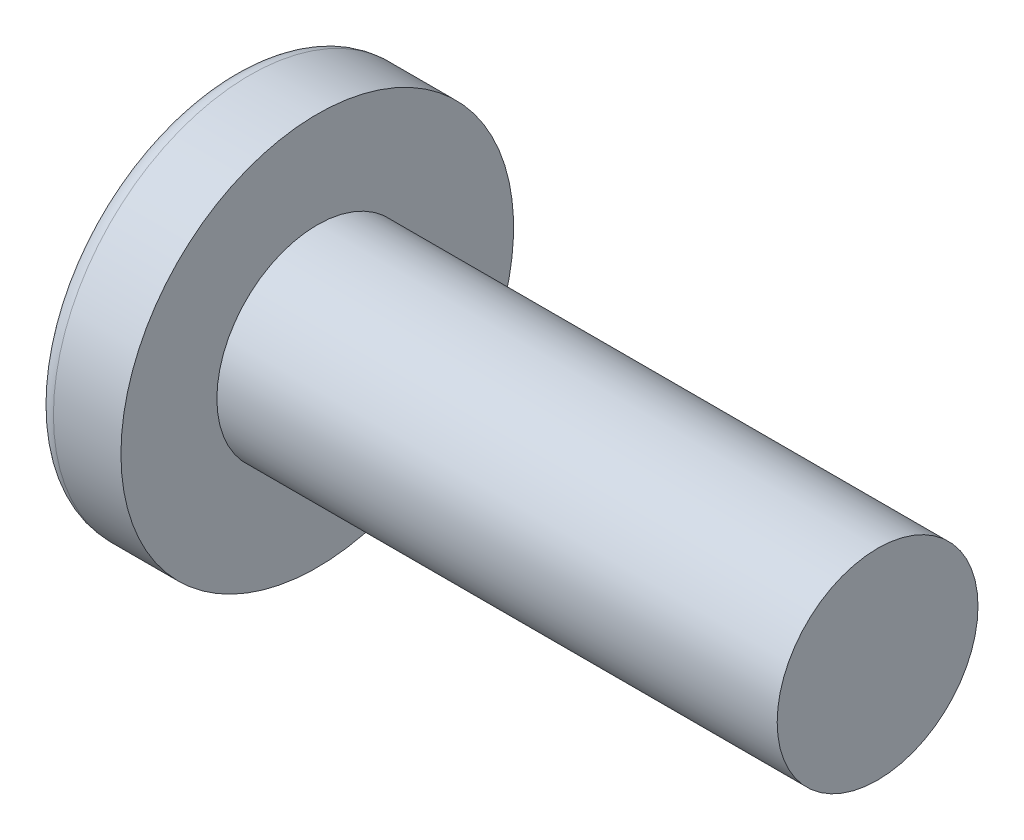
ISO-10303-21;
HEADER;
FILE_DESCRIPTION(('STEP AP214'),'2;1');
FILE_NAME('part.step','',(''),(''),'','','');
FILE_SCHEMA(('AUTOMOTIVE_DESIGN { 1 0 10303 214 1 1 1 1 }'));
ENDSEC;
DATA;
#1=APPLICATION_CONTEXT('core data for automotive mechanical design processes');
#2=APPLICATION_PROTOCOL_DEFINITION('international standard','automotive_design',2000,#1);
#3=PRODUCT_CONTEXT('',#1,'mechanical');
#4=PRODUCT('Part','Part','',(#3));
#5=PRODUCT_RELATED_PRODUCT_CATEGORY('part','',(#4));
#6=PRODUCT_DEFINITION_FORMATION('','',#4);
#7=PRODUCT_DEFINITION_CONTEXT('part definition',#1,'design');
#8=PRODUCT_DEFINITION('design','',#6,#7);
#9=PRODUCT_DEFINITION_SHAPE('','',#8);
#10=(LENGTH_UNIT() NAMED_UNIT(*) SI_UNIT(.MILLI.,.METRE.));
#11=(NAMED_UNIT(*) PLANE_ANGLE_UNIT() SI_UNIT($,.RADIAN.));
#12=(NAMED_UNIT(*) SI_UNIT($,.STERADIAN.) SOLID_ANGLE_UNIT());
#13=UNCERTAINTY_MEASURE_WITH_UNIT(LENGTH_MEASURE(1.E-05),#10,'distance_accuracy_value','');
#14=(GEOMETRIC_REPRESENTATION_CONTEXT(3) GLOBAL_UNCERTAINTY_ASSIGNED_CONTEXT((#13)) GLOBAL_UNIT_ASSIGNED_CONTEXT((#10,
#11,#12)) REPRESENTATION_CONTEXT('',''));
#15=CARTESIAN_POINT('',(0.,0.,0.));
#16=DIRECTION('',(0.,0.,1.));
#17=DIRECTION('',(1.,0.,0.));
#18=AXIS2_PLACEMENT_3D('',#15,#16,#17);
#19=CARTESIAN_POINT('',(4.55168,0.,0.));
#20=DIRECTION('',(-1.,0.,0.));
#21=DIRECTION('',(0.,1.,0.));
#22=AXIS2_PLACEMENT_3D('',#19,#20,#21);
#23=SPHERICAL_SURFACE('',#22,4.55168);
#24=CARTESIAN_POINT('',(0.870207289833468,0.,0.));
#25=DIRECTION('',(-1.,0.,0.));
#26=DIRECTION('',(0.,0.,1.));
#27=AXIS2_PLACEMENT_3D('',#24,#25,#26);
#28=CIRCLE('',#27,2.67666761229314);
#29=CARTESIAN_POINT('',(0.870207289833468,0.,2.67666761229314));
#30=VERTEX_POINT('',#29);
#31=EDGE_CURVE('E152',#30,#30,#28,.T.);
#32=ORIENTED_EDGE('',*,*,#31,.T.);
#33=EDGE_LOOP('',(#32));
#34=FACE_BOUND('',#33,.T.);
#35=CARTESIAN_POINT('',(4.54621406502776,-0.053976107850912,0.));
#36=DIRECTION('',(-0.100750553686815,-0.994911717657301,0.));
#37=DIRECTION('',(0.994911717657301,-0.100750553686815,0.));
#38=AXIS2_PLACEMENT_3D('',#35,#36,#37);
#39=CIRCLE('',#38,4.55135666870178);
#40=CARTESIAN_POINT('',(0.29828010421487,0.376194419826337,1.57634320737159));
#41=VERTEX_POINT('',#40);
#42=CARTESIAN_POINT('',(0.0357821905509186,0.402776487032817,0.402776487032818));
#43=VERTEX_POINT('',#42);
#44=EDGE_CURVE('E183',#41,#43,#39,.T.);
#45=ORIENTED_EDGE('',*,*,#44,.F.);
#46=CARTESIAN_POINT('',(3.65196023945684,0.,-1.11933639500645));
#47=DIRECTION('',(0.626498155753381,0.,0.77942290243334));
#48=DIRECTION('',(0.77942290243334,0.,-0.626498155753381));
#49=AXIS2_PLACEMENT_3D('',#46,#47,#48);
#50=CIRCLE('',#49,4.31918756361681);
#51=CARTESIAN_POINT('',(0.29828010421487,-0.376194419826348,1.57634320737159));
#52=VERTEX_POINT('',#51);
#53=EDGE_CURVE('E148',#41,#52,#50,.T.);
#54=ORIENTED_EDGE('',*,*,#53,.T.);
#55=CARTESIAN_POINT('',(4.54621406502776,0.0539761078509117,0.));
#56=DIRECTION('',(-0.100750553686815,0.9949117176573,0.));
#57=DIRECTION('',(-0.994911717657301,-0.100750553686815,0.));
#58=AXIS2_PLACEMENT_3D('',#55,#56,#57);
#59=CIRCLE('',#58,4.55135666870178);
#60=CARTESIAN_POINT('',(0.0357821905509195,-0.40277648703282,0.402776487032818));
#61=VERTEX_POINT('',#60);
#62=EDGE_CURVE('E104',#61,#52,#59,.T.);
#63=ORIENTED_EDGE('',*,*,#62,.F.);
#64=CARTESIAN_POINT('',(4.54621406502776,0.,-0.0539761078509118));
#65=DIRECTION('',(-0.100750553686815,0.,-0.9949117176573));
#66=DIRECTION('',(-0.994911717657301,0.,0.100750553686815));
#67=AXIS2_PLACEMENT_3D('',#64,#65,#66);
#68=CIRCLE('',#67,4.55135666870178);
#69=CARTESIAN_POINT('',(0.298280104214868,-1.57634320737159,0.376194419826342));
#70=VERTEX_POINT('',#69);
#71=EDGE_CURVE('E129',#70,#61,#68,.T.);
#72=ORIENTED_EDGE('',*,*,#71,.F.);
#73=CARTESIAN_POINT('',(3.65196023945684,1.11933639500645,0.));
#74=DIRECTION('',(0.626498155753381,-0.77942290243334,0.));
#75=DIRECTION('',(0.77942290243334,0.626498155753381,0.));
#76=AXIS2_PLACEMENT_3D('',#73,#74,#75);
#77=CIRCLE('',#76,4.31918756361681);
#78=CARTESIAN_POINT('',(0.298280104214869,-1.57634320737159,-0.376194419826342));
#79=VERTEX_POINT('',#78);
#80=EDGE_CURVE('E137',#70,#79,#77,.T.);
#81=ORIENTED_EDGE('',*,*,#80,.T.);
#82=CARTESIAN_POINT('',(4.54621406502776,0.,0.053976107850912));
#83=DIRECTION('',(-0.100750553686815,0.,0.994911717657301));
#84=DIRECTION('',(0.994911717657301,0.,0.100750553686815));
#85=AXIS2_PLACEMENT_3D('',#82,#83,#84);
#86=CIRCLE('',#85,4.55135666870178);
#87=CARTESIAN_POINT('',(0.0357821905509186,-0.402776487032817,-0.402776487032818));
#88=VERTEX_POINT('',#87);
#89=EDGE_CURVE('E47',#88,#79,#86,.T.);
#90=ORIENTED_EDGE('',*,*,#89,.F.);
#91=CARTESIAN_POINT('',(0.298280104214868,-0.376194419826337,-1.57634320737159));
#92=VERTEX_POINT('',#91);
#93=EDGE_CURVE('E190',#92,#88,#59,.T.);
#94=ORIENTED_EDGE('',*,*,#93,.F.);
#95=CARTESIAN_POINT('',(3.65196023945684,0.,1.11933639500645));
#96=DIRECTION('',(0.626498155753381,0.,-0.77942290243334));
#97=DIRECTION('',(-0.77942290243334,0.,-0.626498155753381));
#98=AXIS2_PLACEMENT_3D('',#95,#96,#97);
#99=CIRCLE('',#98,4.31918756361681);
#100=CARTESIAN_POINT('',(0.298280104214869,0.376194419826348,-1.57634320737159));
#101=VERTEX_POINT('',#100);
#102=EDGE_CURVE('E130',#92,#101,#99,.T.);
#103=ORIENTED_EDGE('',*,*,#102,.T.);
#104=CARTESIAN_POINT('',(0.0357821905509195,0.40277648703282,-0.402776487032818));
#105=VERTEX_POINT('',#104);
#106=EDGE_CURVE('E178',#105,#101,#39,.T.);
#107=ORIENTED_EDGE('',*,*,#106,.F.);
#108=CARTESIAN_POINT('',(0.298280104214869,1.57634320737159,-0.376194419826342));
#109=VERTEX_POINT('',#108);
#110=EDGE_CURVE('E40',#109,#105,#86,.T.);
#111=ORIENTED_EDGE('',*,*,#110,.F.);
#112=CARTESIAN_POINT('',(3.65196023945684,-1.11933639500645,0.));
#113=DIRECTION('',(0.626498155753381,0.77942290243334,0.));
#114=DIRECTION('',(-0.77942290243334,0.626498155753381,0.));
#115=AXIS2_PLACEMENT_3D('',#112,#113,#114);
#116=CIRCLE('',#115,4.31918756361681);
#117=CARTESIAN_POINT('',(0.298280104214869,1.57634320737159,0.376194419826342));
#118=VERTEX_POINT('',#117);
#119=EDGE_CURVE('E11',#109,#118,#116,.T.);
#120=ORIENTED_EDGE('',*,*,#119,.T.);
#121=EDGE_CURVE('E166',#43,#118,#68,.T.);
#122=ORIENTED_EDGE('',*,*,#121,.F.);
#123=EDGE_LOOP('',(#45,#54,#63,#72,#81,#90,#94,#103,#107,#111,#120,#122));
#124=FACE_BOUND('',#123,.T.);
#125=ADVANCED_FACE('F32',(#34,#124),#23,.T.);
#126=CARTESIAN_POINT('',(2.2594,0.,-0.1776));
#127=DIRECTION('',(-0.100750553686815,0.,0.994911717657301));
#128=DIRECTION('',(0.994911717657301,0.,0.100750553686815));
#129=AXIS2_PLACEMENT_3D('',#126,#127,#128);
#130=PLANE('',#129);
#131=ORIENTED_EDGE('',*,*,#110,.T.);
#132=DIRECTION('',(0.989900325021556,-0.100243070888259,0.100243070888259));
#133=VECTOR('',#132,1.);
#134=CARTESIAN_POINT('',(2.27702336316533,0.175815355628828,-0.175815355628827));
#135=LINE('',#134,#133);
#136=CARTESIAN_POINT('',(2.0066,0.203200000000001,-0.203199999999999));
#137=VERTEX_POINT('',#136);
#138=EDGE_CURVE('E172',#105,#137,#135,.T.);
#139=ORIENTED_EDGE('',*,*,#138,.T.);
#140=DIRECTION('',(0.777006374114706,-0.624555756408656,0.0786841897837677));
#141=VECTOR('',#140,1.);
#142=CARTESIAN_POINT('',(0.,1.8161,-0.4064));
#143=LINE('',#142,#141);
#144=EDGE_CURVE('E153',#109,#137,#143,.T.);
#145=ORIENTED_EDGE('',*,*,#144,.F.);
#146=EDGE_LOOP('',(#131,#139,#145));
#147=FACE_BOUND('',#146,.T.);
#148=ADVANCED_FACE('F171',(#147),#130,.T.);
#149=DIRECTION('',(0.777006374114706,0.624555756408656,0.0786841897837677));
#150=VECTOR('',#149,1.);
#151=CARTESIAN_POINT('',(0.,-1.8161,-0.4064));
#152=LINE('',#151,#150);
#153=CARTESIAN_POINT('',(2.0066,-0.2032,-0.2032));
#154=VERTEX_POINT('',#153);
#155=EDGE_CURVE('E138',#79,#154,#152,.T.);
#156=ORIENTED_EDGE('',*,*,#155,.T.);
#157=DIRECTION('',(-0.989900325021557,-0.100243070888258,-0.100243070888259));
#158=VECTOR('',#157,1.);
#159=CARTESIAN_POINT('',(2.27702336316533,-0.175815355628826,-0.175815355628827));
#160=LINE('',#159,#158);
#161=EDGE_CURVE('E193',#154,#88,#160,.T.);
#162=ORIENTED_EDGE('',*,*,#161,.T.);
#163=ORIENTED_EDGE('',*,*,#89,.T.);
#164=EDGE_LOOP('',(#156,#162,#163));
#165=FACE_BOUND('',#164,.T.);
#166=ADVANCED_FACE('F208',(#165),#130,.T.);
#167=CARTESIAN_POINT('',(2.2594,0.,0.1776));
#168=DIRECTION('',(-0.100750553686815,0.,-0.9949117176573));
#169=DIRECTION('',(-0.994911717657301,0.,0.100750553686815));
#170=AXIS2_PLACEMENT_3D('',#167,#168,#169);
#171=PLANE('',#170);
#172=DIRECTION('',(0.777006374114706,-0.624555756408656,-0.0786841897837678));
#173=VECTOR('',#172,1.);
#174=CARTESIAN_POINT('',(0.,1.8161,0.4064));
#175=LINE('',#174,#173);
#176=CARTESIAN_POINT('',(2.0066,0.2032,0.2032));
#177=VERTEX_POINT('',#176);
#178=EDGE_CURVE('E209',#118,#177,#175,.T.);
#179=ORIENTED_EDGE('',*,*,#178,.T.);
#180=DIRECTION('',(-0.989900325021557,0.100243070888259,0.100243070888259));
#181=VECTOR('',#180,1.);
#182=CARTESIAN_POINT('',(2.27702336316533,0.175815355628826,0.175815355628827));
#183=LINE('',#182,#181);
#184=EDGE_CURVE('E187',#177,#43,#183,.T.);
#185=ORIENTED_EDGE('',*,*,#184,.T.);
#186=ORIENTED_EDGE('',*,*,#121,.T.);
#187=EDGE_LOOP('',(#179,#185,#186));
#188=FACE_BOUND('',#187,.T.);
#189=ADVANCED_FACE('F213',(#188),#171,.T.);
#190=ORIENTED_EDGE('',*,*,#71,.T.);
#191=DIRECTION('',(0.989900325021556,0.100243070888259,-0.100243070888259));
#192=VECTOR('',#191,1.);
#193=CARTESIAN_POINT('',(2.27702336316533,-0.175815355628828,0.175815355628827));
#194=LINE('',#193,#192);
#195=CARTESIAN_POINT('',(2.0066,-0.203200000000001,0.203199999999999));
#196=VERTEX_POINT('',#195);
#197=EDGE_CURVE('E102',#61,#196,#194,.T.);
#198=ORIENTED_EDGE('',*,*,#197,.T.);
#199=DIRECTION('',(0.777006374114707,0.624555756408656,-0.0786841897837676));
#200=VECTOR('',#199,1.);
#201=CARTESIAN_POINT('',(0.,-1.8161,0.4064));
#202=LINE('',#201,#200);
#203=EDGE_CURVE('E127',#70,#196,#202,.T.);
#204=ORIENTED_EDGE('',*,*,#203,.F.);
#205=EDGE_LOOP('',(#190,#198,#204));
#206=FACE_BOUND('',#205,.T.);
#207=ADVANCED_FACE('F126',(#206),#171,.T.);
#208=CARTESIAN_POINT('',(-25.4,0.,0.));
#209=DIRECTION('',(-1.,0.,0.));
#210=DIRECTION('',(0.,0.,1.));
#211=AXIS2_PLACEMENT_3D('',#208,#209,#210);
#212=CYLINDRICAL_SURFACE('',#211,1.4224);
#213=CARTESIAN_POINT('',(9.9695,0.,0.));
#214=DIRECTION('',(-1.,0.,0.));
#215=DIRECTION('',(0.,0.,1.));
#216=AXIS2_PLACEMENT_3D('',#213,#214,#215);
#217=CIRCLE('',#216,1.4224);
#218=CARTESIAN_POINT('',(9.9695,0.,1.4224));
#219=VERTEX_POINT('',#218);
#220=EDGE_CURVE('E149',#219,#219,#217,.T.);
#221=ORIENTED_EDGE('',*,*,#220,.T.);
#222=EDGE_LOOP('',(#221));
#223=FACE_BOUND('',#222,.T.);
#224=CARTESIAN_POINT('',(2.032,0.,0.));
#225=DIRECTION('',(-1.,0.,0.));
#226=DIRECTION('',(0.,0.,1.));
#227=AXIS2_PLACEMENT_3D('',#224,#225,#226);
#228=CIRCLE('',#227,1.4224);
#229=CARTESIAN_POINT('',(2.032,0.,1.4224));
#230=VERTEX_POINT('',#229);
#231=EDGE_CURVE('E162',#230,#230,#228,.T.);
#232=ORIENTED_EDGE('',*,*,#231,.F.);
#233=EDGE_LOOP('',(#232));
#234=FACE_BOUND('',#233,.T.);
#235=ADVANCED_FACE('F34',(#223,#234),#212,.T.);
#236=CARTESIAN_POINT('',(2.032,1.4224,0.));
#237=DIRECTION('',(-1.,0.,0.));
#238=DIRECTION('',(0.,0.,1.));
#239=AXIS2_PLACEMENT_3D('',#236,#237,#238);
#240=PLANE('',#239);
#241=CARTESIAN_POINT('',(2.032,0.,0.));
#242=DIRECTION('',(-1.,0.,0.));
#243=DIRECTION('',(0.,0.,1.));
#244=AXIS2_PLACEMENT_3D('',#241,#242,#243);
#245=CIRCLE('',#244,2.7813);
#246=CARTESIAN_POINT('',(2.032,0.,2.7813));
#247=VERTEX_POINT('',#246);
#248=EDGE_CURVE('E159',#247,#247,#245,.T.);
#249=ORIENTED_EDGE('',*,*,#248,.F.);
#250=EDGE_LOOP('',(#249));
#251=FACE_BOUND('',#250,.T.);
#252=ORIENTED_EDGE('',*,*,#231,.T.);
#253=EDGE_LOOP('',(#252));
#254=FACE_BOUND('',#253,.T.);
#255=ADVANCED_FACE('F241',(#251,#254),#240,.F.);
#256=CARTESIAN_POINT('',(-25.4,0.,0.));
#257=DIRECTION('',(-1.,0.,0.));
#258=DIRECTION('',(0.,0.,1.));
#259=AXIS2_PLACEMENT_3D('',#256,#257,#258);
#260=CYLINDRICAL_SURFACE('',#259,2.7813);
#261=ORIENTED_EDGE('',*,*,#248,.T.);
#262=EDGE_LOOP('',(#261));
#263=FACE_BOUND('',#262,.T.);
#264=CARTESIAN_POINT('',(1.07564661517758,0.,0.));
#265=DIRECTION('',(-1.,0.,0.));
#266=DIRECTION('',(0.,0.,1.));
#267=AXIS2_PLACEMENT_3D('',#264,#265,#266);
#268=CIRCLE('',#267,2.7813);
#269=CARTESIAN_POINT('',(1.07564661517758,0.,2.7813));
#270=VERTEX_POINT('',#269);
#271=EDGE_CURVE('E156',#270,#270,#268,.T.);
#272=ORIENTED_EDGE('',*,*,#271,.F.);
#273=EDGE_LOOP('',(#272));
#274=FACE_BOUND('',#273,.T.);
#275=ADVANCED_FACE('F238',(#263,#274),#260,.T.);
#276=CARTESIAN_POINT('',(1.07564661517758,0.,0.));
#277=DIRECTION('',(-1.,0.,0.));
#278=DIRECTION('',(0.,0.,1.));
#279=AXIS2_PLACEMENT_3D('',#276,#277,#278);
#280=TOROIDAL_SURFACE('',#279,2.5273,0.254);
#281=ORIENTED_EDGE('',*,*,#271,.T.);
#282=EDGE_LOOP('',(#281));
#283=FACE_BOUND('',#282,.T.);
#284=ORIENTED_EDGE('',*,*,#31,.F.);
#285=EDGE_LOOP('',(#284));
#286=FACE_BOUND('',#285,.T.);
#287=ADVANCED_FACE('F235',(#283,#286),#280,.T.);
#288=CARTESIAN_POINT('',(9.9695,1.4224,0.));
#289=DIRECTION('',(1.,0.,0.));
#290=DIRECTION('',(0.,0.,-1.));
#291=AXIS2_PLACEMENT_3D('',#288,#289,#290);
#292=PLANE('',#291);
#293=ORIENTED_EDGE('',*,*,#220,.F.);
#294=EDGE_LOOP('',(#293));
#295=FACE_BOUND('',#294,.T.);
#296=ADVANCED_FACE('F233',(#295),#292,.T.);
#297=CARTESIAN_POINT('',(2.0066,0.2032,0.2032));
#298=DIRECTION('',(0.626498155753381,0.77942290243334,0.));
#299=DIRECTION('',(-0.77942290243334,0.626498155753381,0.));
#300=AXIS2_PLACEMENT_3D('',#297,#298,#299);
#301=PLANE('',#300);
#302=ORIENTED_EDGE('',*,*,#144,.T.);
#303=DIRECTION('',(0.,0.,-1.));
#304=VECTOR('',#303,1.);
#305=CARTESIAN_POINT('',(2.0066,0.2032,0.2032));
#306=LINE('',#305,#304);
#307=EDGE_CURVE('E120',#177,#137,#306,.T.);
#308=ORIENTED_EDGE('',*,*,#307,.F.);
#309=ORIENTED_EDGE('',*,*,#178,.F.);
#310=ORIENTED_EDGE('',*,*,#119,.F.);
#311=EDGE_LOOP('',(#302,#308,#309,#310));
#312=FACE_BOUND('',#311,.T.);
#313=ADVANCED_FACE('F212',(#312),#301,.F.);
#314=CARTESIAN_POINT('',(2.0066,-0.2032,-0.2032));
#315=DIRECTION('',(0.626498155753381,-0.77942290243334,0.));
#316=DIRECTION('',(0.77942290243334,0.626498155753381,0.));
#317=AXIS2_PLACEMENT_3D('',#314,#315,#316);
#318=PLANE('',#317);
#319=ORIENTED_EDGE('',*,*,#203,.T.);
#320=DIRECTION('',(0.,0.,1.));
#321=VECTOR('',#320,1.);
#322=CARTESIAN_POINT('',(2.0066,-0.2032,-0.2032));
#323=LINE('',#322,#321);
#324=EDGE_CURVE('E119',#154,#196,#323,.T.);
#325=ORIENTED_EDGE('',*,*,#324,.F.);
#326=ORIENTED_EDGE('',*,*,#155,.F.);
#327=ORIENTED_EDGE('',*,*,#80,.F.);
#328=EDGE_LOOP('',(#319,#325,#326,#327));
#329=FACE_BOUND('',#328,.T.);
#330=ADVANCED_FACE('F134',(#329),#318,.F.);
#331=CARTESIAN_POINT('',(2.0066,0.2032,-0.2032));
#332=DIRECTION('',(-1.,0.,0.));
#333=DIRECTION('',(0.,0.,1.));
#334=AXIS2_PLACEMENT_3D('',#331,#332,#333);
#335=PLANE('',#334);
#336=DIRECTION('',(0.,1.,0.));
#337=VECTOR('',#336,1.);
#338=CARTESIAN_POINT('',(2.0066,-0.2032,-0.2032));
#339=LINE('',#338,#337);
#340=EDGE_CURVE('E142',#154,#137,#339,.T.);
#341=ORIENTED_EDGE('',*,*,#340,.F.);
#342=ORIENTED_EDGE('',*,*,#324,.T.);
#343=DIRECTION('',(0.,-1.,0.));
#344=VECTOR('',#343,1.);
#345=CARTESIAN_POINT('',(2.0066,0.2032,0.2032));
#346=LINE('',#345,#344);
#347=EDGE_CURVE('E111',#177,#196,#346,.T.);
#348=ORIENTED_EDGE('',*,*,#347,.F.);
#349=ORIENTED_EDGE('',*,*,#307,.T.);
#350=EDGE_LOOP('',(#341,#342,#348,#349));
#351=FACE_BOUND('',#350,.T.);
#352=ADVANCED_FACE('F140',(#351),#335,.T.);
#353=CARTESIAN_POINT('',(2.0066,0.203200000000001,-0.203199999999999));
#354=DIRECTION('',(0.626498155753381,0.,-0.77942290243334));
#355=DIRECTION('',(0.77942290243334,0.,0.626498155753381));
#356=AXIS2_PLACEMENT_3D('',#353,#354,#355);
#357=PLANE('',#356);
#358=DIRECTION('',(0.777006374114707,0.0786841897837654,0.624555756408657));
#359=VECTOR('',#358,1.);
#360=CARTESIAN_POINT('',(0.,-0.406399999999993,-1.8161));
#361=LINE('',#360,#359);
#362=EDGE_CURVE('E198',#92,#154,#361,.T.);
#363=ORIENTED_EDGE('',*,*,#362,.T.);
#364=ORIENTED_EDGE('',*,*,#340,.T.);
#365=DIRECTION('',(0.777006374114706,-0.0786841897837699,0.624555756408656));
#366=VECTOR('',#365,1.);
#367=CARTESIAN_POINT('',(0.,0.406400000000006,-1.8161));
#368=LINE('',#367,#366);
#369=EDGE_CURVE('E108',#101,#137,#368,.T.);
#370=ORIENTED_EDGE('',*,*,#369,.F.);
#371=ORIENTED_EDGE('',*,*,#102,.F.);
#372=EDGE_LOOP('',(#363,#364,#370,#371));
#373=FACE_BOUND('',#372,.T.);
#374=ADVANCED_FACE('F203',(#373),#357,.F.);
#375=CARTESIAN_POINT('',(2.2594,-0.1776,0.));
#376=DIRECTION('',(-0.100750553686815,0.9949117176573,0.));
#377=DIRECTION('',(-0.994911717657301,-0.100750553686815,0.));
#378=AXIS2_PLACEMENT_3D('',#375,#376,#377);
#379=PLANE('',#378);
#380=ORIENTED_EDGE('',*,*,#93,.T.);
#381=ORIENTED_EDGE('',*,*,#161,.F.);
#382=ORIENTED_EDGE('',*,*,#362,.F.);
#383=EDGE_LOOP('',(#380,#381,#382));
#384=FACE_BOUND('',#383,.T.);
#385=ADVANCED_FACE('F207',(#384),#379,.T.);
#386=CARTESIAN_POINT('',(2.2594,0.1776,0.));
#387=DIRECTION('',(-0.100750553686815,-0.994911717657301,0.));
#388=DIRECTION('',(0.994911717657301,-0.100750553686815,0.));
#389=AXIS2_PLACEMENT_3D('',#386,#387,#388);
#390=PLANE('',#389);
#391=ORIENTED_EDGE('',*,*,#106,.T.);
#392=ORIENTED_EDGE('',*,*,#369,.T.);
#393=ORIENTED_EDGE('',*,*,#138,.F.);
#394=EDGE_LOOP('',(#391,#392,#393));
#395=FACE_BOUND('',#394,.T.);
#396=ADVANCED_FACE('F201',(#395),#390,.T.);
#397=CARTESIAN_POINT('',(2.0066,-0.203200000000001,0.203199999999999));
#398=DIRECTION('',(0.626498155753381,0.,0.77942290243334));
#399=DIRECTION('',(-0.77942290243334,0.,0.626498155753381));
#400=AXIS2_PLACEMENT_3D('',#397,#398,#399);
#401=PLANE('',#400);
#402=DIRECTION('',(0.777006374114706,-0.0786841897837656,-0.624555756408657));
#403=VECTOR('',#402,1.);
#404=CARTESIAN_POINT('',(0.,0.406399999999994,1.8161));
#405=LINE('',#404,#403);
#406=EDGE_CURVE('E107',#41,#177,#405,.T.);
#407=ORIENTED_EDGE('',*,*,#406,.T.);
#408=ORIENTED_EDGE('',*,*,#347,.T.);
#409=DIRECTION('',(0.777006374114706,0.0786841897837699,-0.624555756408656));
#410=VECTOR('',#409,1.);
#411=CARTESIAN_POINT('',(0.,-0.406400000000006,1.8161));
#412=LINE('',#411,#410);
#413=EDGE_CURVE('E98',#52,#196,#412,.T.);
#414=ORIENTED_EDGE('',*,*,#413,.F.);
#415=ORIENTED_EDGE('',*,*,#53,.F.);
#416=EDGE_LOOP('',(#407,#408,#414,#415));
#417=FACE_BOUND('',#416,.T.);
#418=ADVANCED_FACE('F112',(#417),#401,.F.);
#419=ORIENTED_EDGE('',*,*,#44,.T.);
#420=ORIENTED_EDGE('',*,*,#184,.F.);
#421=ORIENTED_EDGE('',*,*,#406,.F.);
#422=EDGE_LOOP('',(#419,#420,#421));
#423=FACE_BOUND('',#422,.T.);
#424=ADVANCED_FACE('F214',(#423),#390,.T.);
#425=ORIENTED_EDGE('',*,*,#62,.T.);
#426=ORIENTED_EDGE('',*,*,#413,.T.);
#427=ORIENTED_EDGE('',*,*,#197,.F.);
#428=EDGE_LOOP('',(#425,#426,#427));
#429=FACE_BOUND('',#428,.T.);
#430=ADVANCED_FACE('F100',(#429),#379,.T.);
#431=CLOSED_SHELL('',(#125,#148,#166,#189,#207,#235,#255,#275,#287,#296,#313,#330,#352,#374,
#385,#396,#418,#424,#430));
#432=MANIFOLD_SOLID_BREP('B2',#431);
#433=ADVANCED_BREP_SHAPE_REPRESENTATION('',(#18,#432),#14);
#434=SHAPE_DEFINITION_REPRESENTATION(#9,#433);
ENDSEC;
END-ISO-10303-21;
